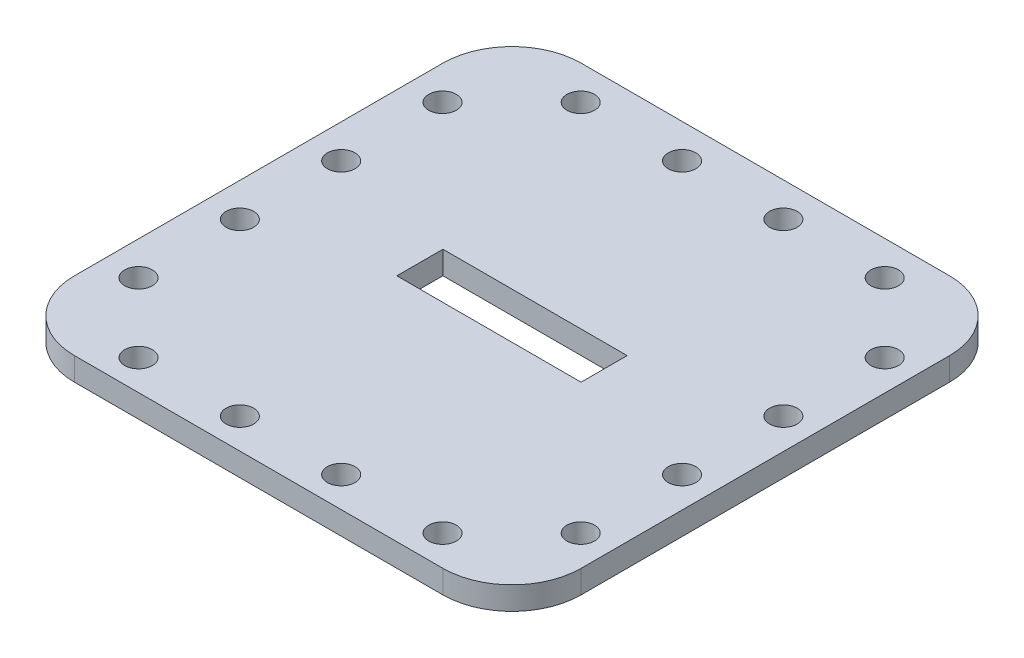
ISO-10303-21;
HEADER;
FILE_DESCRIPTION(('STEP AP214'),'2;1');
FILE_NAME('part.step','',(''),(''),'','','');
FILE_SCHEMA(('AUTOMOTIVE_DESIGN { 1 0 10303 214 1 1 1 1 }'));
ENDSEC;
DATA;
#1=APPLICATION_CONTEXT('core data for automotive mechanical design processes');
#2=APPLICATION_PROTOCOL_DEFINITION('international standard','automotive_design',2000,#1);
#3=PRODUCT_CONTEXT('',#1,'mechanical');
#4=PRODUCT('Part','Part','',(#3));
#5=PRODUCT_RELATED_PRODUCT_CATEGORY('part','',(#4));
#6=PRODUCT_DEFINITION_FORMATION('','',#4);
#7=PRODUCT_DEFINITION_CONTEXT('part definition',#1,'design');
#8=PRODUCT_DEFINITION('design','',#6,#7);
#9=PRODUCT_DEFINITION_SHAPE('','',#8);
#10=(LENGTH_UNIT() NAMED_UNIT(*) SI_UNIT(.MILLI.,.METRE.));
#11=(NAMED_UNIT(*) PLANE_ANGLE_UNIT() SI_UNIT($,.RADIAN.));
#12=(NAMED_UNIT(*) SI_UNIT($,.STERADIAN.) SOLID_ANGLE_UNIT());
#13=UNCERTAINTY_MEASURE_WITH_UNIT(LENGTH_MEASURE(1.E-05),#10,'distance_accuracy_value','');
#14=(GEOMETRIC_REPRESENTATION_CONTEXT(3) GLOBAL_UNCERTAINTY_ASSIGNED_CONTEXT((#13)) GLOBAL_UNIT_ASSIGNED_CONTEXT((#10,
#11,#12)) REPRESENTATION_CONTEXT('',''));
#15=CARTESIAN_POINT('',(0.,0.,0.));
#16=DIRECTION('',(0.,0.,1.));
#17=DIRECTION('',(1.,0.,0.));
#18=AXIS2_PLACEMENT_3D('',#15,#16,#17);
#19=CARTESIAN_POINT('',(40.,5.,55.));
#20=DIRECTION('',(0.,1.,0.));
#21=DIRECTION('',(0.,0.,1.));
#22=AXIS2_PLACEMENT_3D('',#19,#20,#21);
#23=PLANE('',#22);
#24=DIRECTION('',(0.,0.,-1.));
#25=VECTOR('',#24,1.);
#26=CARTESIAN_POINT('',(20.,5.,5.));
#27=LINE('',#26,#25);
#28=CARTESIAN_POINT('',(20.,5.,5.));
#29=VERTEX_POINT('',#28);
#30=CARTESIAN_POINT('',(20.,5.,-5.));
#31=VERTEX_POINT('',#30);
#32=EDGE_CURVE('E59',#29,#31,#27,.T.);
#33=ORIENTED_EDGE('',*,*,#32,.F.);
#34=DIRECTION('',(1.,0.,0.));
#35=VECTOR('',#34,1.);
#36=CARTESIAN_POINT('',(-20.,5.,5.));
#37=LINE('',#36,#35);
#38=CARTESIAN_POINT('',(-20.,5.,5.));
#39=VERTEX_POINT('',#38);
#40=EDGE_CURVE('E151',#39,#29,#37,.T.);
#41=ORIENTED_EDGE('',*,*,#40,.F.);
#42=DIRECTION('',(0.,0.,1.));
#43=VECTOR('',#42,1.);
#44=CARTESIAN_POINT('',(-20.,5.,5.));
#45=LINE('',#44,#43);
#46=CARTESIAN_POINT('',(-20.,5.,-5.));
#47=VERTEX_POINT('',#46);
#48=EDGE_CURVE('E135',#47,#39,#45,.T.);
#49=ORIENTED_EDGE('',*,*,#48,.F.);
#50=DIRECTION('',(-1.,0.,0.));
#51=VECTOR('',#50,1.);
#52=CARTESIAN_POINT('',(-20.,5.,-5.));
#53=LINE('',#52,#51);
#54=EDGE_CURVE('E144',#31,#47,#53,.T.);
#55=ORIENTED_EDGE('',*,*,#54,.F.);
#56=EDGE_LOOP('',(#33,#41,#49,#55));
#57=FACE_BOUND('',#56,.T.);
#58=CARTESIAN_POINT('',(48.3346963055934,5.,-10.5816296180082));
#59=DIRECTION('',(0.,-1.,0.));
#60=DIRECTION('',(0.,0.,-1.));
#61=AXIS2_PLACEMENT_3D('',#58,#59,#60);
#62=CIRCLE('',#61,3.00000000000002);
#63=CARTESIAN_POINT('',(48.3346963055934,5.,-13.5816296180082));
#64=VERTEX_POINT('',#63);
#65=EDGE_CURVE('E170',#64,#64,#62,.T.);
#66=ORIENTED_EDGE('',*,*,#65,.T.);
#67=EDGE_LOOP('',(#66));
#68=FACE_BOUND('',#67,.T.);
#69=CARTESIAN_POINT('',(-32.6653036944065,5.,-47.5816296180083));
#70=DIRECTION('',(0.,-1.,0.));
#71=DIRECTION('',(0.,0.,-1.));
#72=AXIS2_PLACEMENT_3D('',#69,#70,#71);
#73=CIRCLE('',#72,3.00000000000001);
#74=CARTESIAN_POINT('',(-32.6653036944065,5.,-50.5816296180083));
#75=VERTEX_POINT('',#74);
#76=EDGE_CURVE('E175',#75,#75,#73,.T.);
#77=ORIENTED_EDGE('',*,*,#76,.T.);
#78=EDGE_LOOP('',(#77));
#79=FACE_BOUND('',#78,.T.);
#80=CARTESIAN_POINT('',(-47.6653036944066,5.,-32.5816296180082));
#81=DIRECTION('',(0.,-1.,0.));
#82=DIRECTION('',(0.,0.,-1.));
#83=AXIS2_PLACEMENT_3D('',#80,#81,#82);
#84=CIRCLE('',#83,3.);
#85=CARTESIAN_POINT('',(-47.6653036944066,5.,-35.5816296180082));
#86=VERTEX_POINT('',#85);
#87=EDGE_CURVE('E184',#86,#86,#84,.T.);
#88=ORIENTED_EDGE('',*,*,#87,.T.);
#89=EDGE_LOOP('',(#88));
#90=FACE_BOUND('',#89,.T.);
#91=CARTESIAN_POINT('',(-47.6653036944066,5.,-10.5816296180082));
#92=DIRECTION('',(0.,-1.,0.));
#93=DIRECTION('',(0.,0.,-1.));
#94=AXIS2_PLACEMENT_3D('',#91,#92,#93);
#95=CIRCLE('',#94,3.00000000000003);
#96=CARTESIAN_POINT('',(-47.6653036944066,5.,-13.5816296180083));
#97=VERTEX_POINT('',#96);
#98=EDGE_CURVE('E189',#97,#97,#95,.T.);
#99=ORIENTED_EDGE('',*,*,#98,.T.);
#100=EDGE_LOOP('',(#99));
#101=FACE_BOUND('',#100,.T.);
#102=CARTESIAN_POINT('',(-47.6653036944066,5.,11.4183703819918));
#103=DIRECTION('',(0.,-1.,0.));
#104=DIRECTION('',(0.,0.,-1.));
#105=AXIS2_PLACEMENT_3D('',#102,#103,#104);
#106=CIRCLE('',#105,2.99999999999997);
#107=CARTESIAN_POINT('',(-47.6653036944066,5.,8.4183703819918));
#108=VERTEX_POINT('',#107);
#109=EDGE_CURVE('E197',#108,#108,#106,.T.);
#110=ORIENTED_EDGE('',*,*,#109,.T.);
#111=EDGE_LOOP('',(#110));
#112=FACE_BOUND('',#111,.T.);
#113=CARTESIAN_POINT('',(-10.6653036944066,5.,48.4183703819918));
#114=DIRECTION('',(0.,-1.,0.));
#115=DIRECTION('',(0.,0.,-1.));
#116=AXIS2_PLACEMENT_3D('',#113,#114,#115);
#117=CIRCLE('',#116,3.00000000000002);
#118=CARTESIAN_POINT('',(-10.6653036944066,5.,45.4183703819917));
#119=VERTEX_POINT('',#118);
#120=EDGE_CURVE('E201',#119,#119,#117,.T.);
#121=ORIENTED_EDGE('',*,*,#120,.T.);
#122=EDGE_LOOP('',(#121));
#123=FACE_BOUND('',#122,.T.);
#124=CARTESIAN_POINT('',(11.3346963055934,5.,48.4183703819918));
#125=DIRECTION('',(0.,-1.,0.));
#126=DIRECTION('',(0.,0.,-1.));
#127=AXIS2_PLACEMENT_3D('',#124,#125,#126);
#128=CIRCLE('',#127,2.99999999999997);
#129=CARTESIAN_POINT('',(11.3346963055934,5.,45.4183703819918));
#130=VERTEX_POINT('',#129);
#131=EDGE_CURVE('E206',#130,#130,#128,.T.);
#132=ORIENTED_EDGE('',*,*,#131,.T.);
#133=EDGE_LOOP('',(#132));
#134=FACE_BOUND('',#133,.T.);
#135=CARTESIAN_POINT('',(33.3346963055934,5.,48.4183703819918));
#136=DIRECTION('',(0.,-1.,0.));
#137=DIRECTION('',(0.,0.,-1.));
#138=AXIS2_PLACEMENT_3D('',#135,#136,#137);
#139=CIRCLE('',#138,3.00000000000001);
#140=CARTESIAN_POINT('',(33.3346963055934,5.,45.4183703819917));
#141=VERTEX_POINT('',#140);
#142=EDGE_CURVE('E211',#141,#141,#139,.T.);
#143=ORIENTED_EDGE('',*,*,#142,.T.);
#144=EDGE_LOOP('',(#143));
#145=FACE_BOUND('',#144,.T.);
#146=CARTESIAN_POINT('',(48.3346963055934,5.,11.4183703819918));
#147=DIRECTION('',(0.,-1.,0.));
#148=DIRECTION('',(0.,0.,-1.));
#149=AXIS2_PLACEMENT_3D('',#146,#147,#148);
#150=CIRCLE('',#149,2.99999999999997);
#151=CARTESIAN_POINT('',(48.3346963055934,5.,8.4183703819918));
#152=VERTEX_POINT('',#151);
#153=EDGE_CURVE('E219',#152,#152,#150,.T.);
#154=ORIENTED_EDGE('',*,*,#153,.T.);
#155=EDGE_LOOP('',(#154));
#156=FACE_BOUND('',#155,.T.);
#157=CARTESIAN_POINT('',(48.3346963055935,5.,-32.5816296180082));
#158=DIRECTION('',(0.,-1.,0.));
#159=DIRECTION('',(0.,0.,-1.));
#160=AXIS2_PLACEMENT_3D('',#157,#158,#159);
#161=CIRCLE('',#160,3.00000000000001);
#162=CARTESIAN_POINT('',(48.3346963055935,5.,-35.5816296180082));
#163=VERTEX_POINT('',#162);
#164=EDGE_CURVE('E223',#163,#163,#161,.T.);
#165=ORIENTED_EDGE('',*,*,#164,.T.);
#166=EDGE_LOOP('',(#165));
#167=FACE_BOUND('',#166,.T.);
#168=CARTESIAN_POINT('',(33.3346963055935,5.,-47.5816296180082));
#169=DIRECTION('',(0.,-1.,0.));
#170=DIRECTION('',(0.,0.,-1.));
#171=AXIS2_PLACEMENT_3D('',#168,#169,#170);
#172=CIRCLE('',#171,2.99999999999997);
#173=CARTESIAN_POINT('',(33.3346963055935,5.,-50.5816296180082));
#174=VERTEX_POINT('',#173);
#175=EDGE_CURVE('E228',#174,#174,#172,.T.);
#176=ORIENTED_EDGE('',*,*,#175,.T.);
#177=EDGE_LOOP('',(#176));
#178=FACE_BOUND('',#177,.T.);
#179=CARTESIAN_POINT('',(11.3346963055935,5.,-47.5816296180082));
#180=DIRECTION('',(0.,-1.,0.));
#181=DIRECTION('',(0.,0.,-1.));
#182=AXIS2_PLACEMENT_3D('',#179,#180,#181);
#183=CIRCLE('',#182,2.99999999999997);
#184=CARTESIAN_POINT('',(11.3346963055935,5.,-50.5816296180082));
#185=VERTEX_POINT('',#184);
#186=EDGE_CURVE('E233',#185,#185,#183,.T.);
#187=ORIENTED_EDGE('',*,*,#186,.T.);
#188=EDGE_LOOP('',(#187));
#189=FACE_BOUND('',#188,.T.);
#190=CARTESIAN_POINT('',(-10.6653036944065,5.,-47.5816296180082));
#191=DIRECTION('',(0.,-1.,0.));
#192=DIRECTION('',(0.,0.,-1.));
#193=AXIS2_PLACEMENT_3D('',#190,#191,#192);
#194=CIRCLE('',#193,3.00000000000002);
#195=CARTESIAN_POINT('',(-10.6653036944065,5.,-50.5816296180083));
#196=VERTEX_POINT('',#195);
#197=EDGE_CURVE('E241',#196,#196,#194,.T.);
#198=ORIENTED_EDGE('',*,*,#197,.T.);
#199=EDGE_LOOP('',(#198));
#200=FACE_BOUND('',#199,.T.);
#201=CARTESIAN_POINT('',(-47.6653036944065,5.,33.4183703819918));
#202=DIRECTION('',(0.,-1.,0.));
#203=DIRECTION('',(0.,0.,-1.));
#204=AXIS2_PLACEMENT_3D('',#201,#202,#203);
#205=CIRCLE('',#204,3.);
#206=CARTESIAN_POINT('',(-47.6653036944065,5.,30.4183703819918));
#207=VERTEX_POINT('',#206);
#208=EDGE_CURVE('E245',#207,#207,#205,.T.);
#209=ORIENTED_EDGE('',*,*,#208,.T.);
#210=EDGE_LOOP('',(#209));
#211=FACE_BOUND('',#210,.T.);
#212=CARTESIAN_POINT('',(-32.6653036944065,5.,48.4183703819918));
#213=DIRECTION('',(0.,-1.,0.));
#214=DIRECTION('',(0.,0.,-1.));
#215=AXIS2_PLACEMENT_3D('',#212,#213,#214);
#216=CIRCLE('',#215,3.00000000000001);
#217=CARTESIAN_POINT('',(-32.6653036944065,5.,45.4183703819918));
#218=VERTEX_POINT('',#217);
#219=EDGE_CURVE('E250',#218,#218,#216,.T.);
#220=ORIENTED_EDGE('',*,*,#219,.T.);
#221=EDGE_LOOP('',(#220));
#222=FACE_BOUND('',#221,.T.);
#223=CARTESIAN_POINT('',(48.3346963055934,5.,33.4183703819918));
#224=DIRECTION('',(0.,-1.,0.));
#225=DIRECTION('',(0.,0.,-1.));
#226=AXIS2_PLACEMENT_3D('',#223,#224,#225);
#227=CIRCLE('',#226,3.00000000000001);
#228=CARTESIAN_POINT('',(48.3346963055934,5.,30.4183703819918));
#229=VERTEX_POINT('',#228);
#230=EDGE_CURVE('E255',#229,#229,#227,.T.);
#231=ORIENTED_EDGE('',*,*,#230,.T.);
#232=EDGE_LOOP('',(#231));
#233=FACE_BOUND('',#232,.T.);
#234=DIRECTION('',(1.,0.,0.));
#235=VECTOR('',#234,1.);
#236=CARTESIAN_POINT('',(-55.,5.,55.));
#237=LINE('',#236,#235);
#238=CARTESIAN_POINT('',(-40.,5.,55.));
#239=VERTEX_POINT('',#238);
#240=CARTESIAN_POINT('',(40.,5.,55.));
#241=VERTEX_POINT('',#240);
#242=EDGE_CURVE('E262',#239,#241,#237,.T.);
#243=ORIENTED_EDGE('',*,*,#242,.T.);
#244=CARTESIAN_POINT('',(40.,5.,40.));
#245=DIRECTION('',(0.,-1.,0.));
#246=DIRECTION('',(0.,0.,-1.));
#247=AXIS2_PLACEMENT_3D('',#244,#245,#246);
#248=CIRCLE('',#247,15.);
#249=CARTESIAN_POINT('',(55.,5.,40.));
#250=VERTEX_POINT('',#249);
#251=EDGE_CURVE('E347',#241,#250,#248,.F.);
#252=ORIENTED_EDGE('',*,*,#251,.T.);
#253=DIRECTION('',(0.,0.,-1.));
#254=VECTOR('',#253,1.);
#255=CARTESIAN_POINT('',(55.,5.,55.));
#256=LINE('',#255,#254);
#257=CARTESIAN_POINT('',(55.,5.,-40.));
#258=VERTEX_POINT('',#257);
#259=EDGE_CURVE('E177',#250,#258,#256,.T.);
#260=ORIENTED_EDGE('',*,*,#259,.T.);
#261=CARTESIAN_POINT('',(40.,5.,-40.));
#262=DIRECTION('',(0.,-1.,0.));
#263=DIRECTION('',(0.,0.,-1.));
#264=AXIS2_PLACEMENT_3D('',#261,#262,#263);
#265=CIRCLE('',#264,15.);
#266=CARTESIAN_POINT('',(40.,5.,-55.));
#267=VERTEX_POINT('',#266);
#268=EDGE_CURVE('E318',#258,#267,#265,.F.);
#269=ORIENTED_EDGE('',*,*,#268,.T.);
#270=DIRECTION('',(-1.,0.,0.));
#271=VECTOR('',#270,1.);
#272=CARTESIAN_POINT('',(-55.,5.,-55.));
#273=LINE('',#272,#271);
#274=CARTESIAN_POINT('',(-40.,5.,-55.));
#275=VERTEX_POINT('',#274);
#276=EDGE_CURVE('E273',#267,#275,#273,.T.);
#277=ORIENTED_EDGE('',*,*,#276,.T.);
#278=CARTESIAN_POINT('',(-40.,5.,-40.));
#279=DIRECTION('',(0.,-1.,0.));
#280=DIRECTION('',(0.,0.,-1.));
#281=AXIS2_PLACEMENT_3D('',#278,#279,#280);
#282=CIRCLE('',#281,15.);
#283=CARTESIAN_POINT('',(-55.,5.,-40.));
#284=VERTEX_POINT('',#283);
#285=EDGE_CURVE('E330',#275,#284,#282,.F.);
#286=ORIENTED_EDGE('',*,*,#285,.T.);
#287=DIRECTION('',(0.,0.,1.));
#288=VECTOR('',#287,1.);
#289=CARTESIAN_POINT('',(-55.,5.,55.));
#290=LINE('',#289,#288);
#291=CARTESIAN_POINT('',(-55.,5.,40.));
#292=VERTEX_POINT('',#291);
#293=EDGE_CURVE('E267',#284,#292,#290,.T.);
#294=ORIENTED_EDGE('',*,*,#293,.T.);
#295=CARTESIAN_POINT('',(-40.,5.,40.));
#296=DIRECTION('',(0.,-1.,0.));
#297=DIRECTION('',(0.,0.,-1.));
#298=AXIS2_PLACEMENT_3D('',#295,#296,#297);
#299=CIRCLE('',#298,15.);
#300=EDGE_CURVE('E339',#292,#239,#299,.F.);
#301=ORIENTED_EDGE('',*,*,#300,.T.);
#302=EDGE_LOOP('',(#243,#252,#260,#269,#277,#286,#294,#301));
#303=FACE_BOUND('',#302,.T.);
#304=ADVANCED_FACE('F45',(#57,#68,#79,#90,#101,#112,#123,#134,#145,#156,#167,#178,#189,#200,
#211,#222,#233,#303),#23,.T.);
#305=CARTESIAN_POINT('',(40.,5.,-40.));
#306=DIRECTION('',(0.,1.,0.));
#307=DIRECTION('',(0.,0.,1.));
#308=AXIS2_PLACEMENT_3D('',#305,#306,#307);
#309=CYLINDRICAL_SURFACE('',#308,15.);
#310=DIRECTION('',(0.,1.,0.));
#311=VECTOR('',#310,1.);
#312=CARTESIAN_POINT('',(55.,5.,-40.));
#313=LINE('',#312,#311);
#314=CARTESIAN_POINT('',(55.,0.,-40.));
#315=VERTEX_POINT('',#314);
#316=EDGE_CURVE('E268',#315,#258,#313,.T.);
#317=ORIENTED_EDGE('',*,*,#316,.F.);
#318=CARTESIAN_POINT('',(40.,0.,-40.));
#319=DIRECTION('',(0.,-1.,0.));
#320=DIRECTION('',(0.,0.,-1.));
#321=AXIS2_PLACEMENT_3D('',#318,#319,#320);
#322=CIRCLE('',#321,15.);
#323=CARTESIAN_POINT('',(40.,0.,-55.));
#324=VERTEX_POINT('',#323);
#325=EDGE_CURVE('E313',#324,#315,#322,.T.);
#326=ORIENTED_EDGE('',*,*,#325,.F.);
#327=DIRECTION('',(0.,1.,0.));
#328=VECTOR('',#327,1.);
#329=CARTESIAN_POINT('',(40.,5.,-55.));
#330=LINE('',#329,#328);
#331=EDGE_CURVE('E317',#267,#324,#330,.F.);
#332=ORIENTED_EDGE('',*,*,#331,.F.);
#333=ORIENTED_EDGE('',*,*,#268,.F.);
#334=EDGE_LOOP('',(#317,#326,#332,#333));
#335=FACE_BOUND('',#334,.T.);
#336=ADVANCED_FACE('F320',(#335),#309,.T.);
#337=CARTESIAN_POINT('',(-40.,5.,-40.));
#338=DIRECTION('',(0.,1.,0.));
#339=DIRECTION('',(0.,0.,1.));
#340=AXIS2_PLACEMENT_3D('',#337,#338,#339);
#341=CYLINDRICAL_SURFACE('',#340,15.);
#342=DIRECTION('',(0.,1.,0.));
#343=VECTOR('',#342,1.);
#344=CARTESIAN_POINT('',(-40.,5.,-55.));
#345=LINE('',#344,#343);
#346=CARTESIAN_POINT('',(-40.,0.,-55.));
#347=VERTEX_POINT('',#346);
#348=EDGE_CURVE('E323',#347,#275,#345,.T.);
#349=ORIENTED_EDGE('',*,*,#348,.F.);
#350=CARTESIAN_POINT('',(-40.,0.,-40.));
#351=DIRECTION('',(0.,-1.,0.));
#352=DIRECTION('',(0.,0.,-1.));
#353=AXIS2_PLACEMENT_3D('',#350,#351,#352);
#354=CIRCLE('',#353,15.);
#355=CARTESIAN_POINT('',(-55.,0.,-40.));
#356=VERTEX_POINT('',#355);
#357=EDGE_CURVE('E328',#356,#347,#354,.T.);
#358=ORIENTED_EDGE('',*,*,#357,.F.);
#359=DIRECTION('',(0.,1.,0.));
#360=VECTOR('',#359,1.);
#361=CARTESIAN_POINT('',(-55.,5.,-40.));
#362=LINE('',#361,#360);
#363=EDGE_CURVE('E325',#284,#356,#362,.F.);
#364=ORIENTED_EDGE('',*,*,#363,.F.);
#365=ORIENTED_EDGE('',*,*,#285,.F.);
#366=EDGE_LOOP('',(#349,#358,#364,#365));
#367=FACE_BOUND('',#366,.T.);
#368=ADVANCED_FACE('F435',(#367),#341,.T.);
#369=CARTESIAN_POINT('',(-40.,5.,40.));
#370=DIRECTION('',(0.,1.,0.));
#371=DIRECTION('',(0.,0.,1.));
#372=AXIS2_PLACEMENT_3D('',#369,#370,#371);
#373=CYLINDRICAL_SURFACE('',#372,15.);
#374=DIRECTION('',(0.,1.,0.));
#375=VECTOR('',#374,1.);
#376=CARTESIAN_POINT('',(-55.,5.,40.));
#377=LINE('',#376,#375);
#378=CARTESIAN_POINT('',(-55.,0.,40.));
#379=VERTEX_POINT('',#378);
#380=EDGE_CURVE('E332',#379,#292,#377,.T.);
#381=ORIENTED_EDGE('',*,*,#380,.F.);
#382=CARTESIAN_POINT('',(-40.,0.,40.));
#383=DIRECTION('',(0.,-1.,0.));
#384=DIRECTION('',(0.,0.,-1.));
#385=AXIS2_PLACEMENT_3D('',#382,#383,#384);
#386=CIRCLE('',#385,15.);
#387=CARTESIAN_POINT('',(-40.,0.,55.));
#388=VERTEX_POINT('',#387);
#389=EDGE_CURVE('E337',#388,#379,#386,.T.);
#390=ORIENTED_EDGE('',*,*,#389,.F.);
#391=DIRECTION('',(0.,1.,0.));
#392=VECTOR('',#391,1.);
#393=CARTESIAN_POINT('',(-40.,5.,55.));
#394=LINE('',#393,#392);
#395=EDGE_CURVE('E335',#239,#388,#394,.F.);
#396=ORIENTED_EDGE('',*,*,#395,.F.);
#397=ORIENTED_EDGE('',*,*,#300,.F.);
#398=EDGE_LOOP('',(#381,#390,#396,#397));
#399=FACE_BOUND('',#398,.T.);
#400=ADVANCED_FACE('F440',(#399),#373,.T.);
#401=CARTESIAN_POINT('',(40.,5.,40.));
#402=DIRECTION('',(0.,1.,0.));
#403=DIRECTION('',(0.,0.,1.));
#404=AXIS2_PLACEMENT_3D('',#401,#402,#403);
#405=CYLINDRICAL_SURFACE('',#404,15.);
#406=DIRECTION('',(0.,1.,0.));
#407=VECTOR('',#406,1.);
#408=CARTESIAN_POINT('',(40.,5.,55.));
#409=LINE('',#408,#407);
#410=CARTESIAN_POINT('',(40.,0.,55.));
#411=VERTEX_POINT('',#410);
#412=EDGE_CURVE('E342',#411,#241,#409,.T.);
#413=ORIENTED_EDGE('',*,*,#412,.F.);
#414=CARTESIAN_POINT('',(40.,0.,40.));
#415=DIRECTION('',(0.,-1.,0.));
#416=DIRECTION('',(0.,0.,-1.));
#417=AXIS2_PLACEMENT_3D('',#414,#415,#416);
#418=CIRCLE('',#417,15.);
#419=CARTESIAN_POINT('',(55.,0.,40.));
#420=VERTEX_POINT('',#419);
#421=EDGE_CURVE('E345',#420,#411,#418,.T.);
#422=ORIENTED_EDGE('',*,*,#421,.F.);
#423=DIRECTION('',(0.,1.,0.));
#424=VECTOR('',#423,1.);
#425=CARTESIAN_POINT('',(55.,5.,40.));
#426=LINE('',#425,#424);
#427=EDGE_CURVE('E311',#250,#420,#426,.F.);
#428=ORIENTED_EDGE('',*,*,#427,.F.);
#429=ORIENTED_EDGE('',*,*,#251,.F.);
#430=EDGE_LOOP('',(#413,#422,#428,#429));
#431=FACE_BOUND('',#430,.T.);
#432=ADVANCED_FACE('F455',(#431),#405,.T.);
#433=CARTESIAN_POINT('',(0.,0.,0.));
#434=DIRECTION('',(0.,-1.,0.));
#435=DIRECTION('',(0.,0.,-1.));
#436=AXIS2_PLACEMENT_3D('',#433,#434,#435);
#437=PLANE('',#436);
#438=DIRECTION('',(0.,0.,1.));
#439=VECTOR('',#438,1.);
#440=CARTESIAN_POINT('',(20.,0.,0.));
#441=LINE('',#440,#439);
#442=CARTESIAN_POINT('',(20.,0.,-5.));
#443=VERTEX_POINT('',#442);
#444=CARTESIAN_POINT('',(20.,0.,5.));
#445=VERTEX_POINT('',#444);
#446=EDGE_CURVE('E12',#443,#445,#441,.T.);
#447=ORIENTED_EDGE('',*,*,#446,.F.);
#448=DIRECTION('',(1.,0.,0.));
#449=VECTOR('',#448,1.);
#450=CARTESIAN_POINT('',(0.,0.,-5.));
#451=LINE('',#450,#449);
#452=CARTESIAN_POINT('',(-20.,0.,-5.));
#453=VERTEX_POINT('',#452);
#454=EDGE_CURVE('E361',#453,#443,#451,.T.);
#455=ORIENTED_EDGE('',*,*,#454,.F.);
#456=DIRECTION('',(0.,0.,-1.));
#457=VECTOR('',#456,1.);
#458=CARTESIAN_POINT('',(-20.,0.,0.));
#459=LINE('',#458,#457);
#460=CARTESIAN_POINT('',(-20.,0.,5.));
#461=VERTEX_POINT('',#460);
#462=EDGE_CURVE('E138',#461,#453,#459,.T.);
#463=ORIENTED_EDGE('',*,*,#462,.F.);
#464=DIRECTION('',(-1.,0.,0.));
#465=VECTOR('',#464,1.);
#466=CARTESIAN_POINT('',(0.,0.,5.));
#467=LINE('',#466,#465);
#468=EDGE_CURVE('E52',#445,#461,#467,.T.);
#469=ORIENTED_EDGE('',*,*,#468,.F.);
#470=EDGE_LOOP('',(#447,#455,#463,#469));
#471=FACE_BOUND('',#470,.T.);
#472=CARTESIAN_POINT('',(48.3346963055934,0.,-10.5816296180082));
#473=DIRECTION('',(0.,-1.,0.));
#474=DIRECTION('',(0.,0.,-1.));
#475=AXIS2_PLACEMENT_3D('',#472,#473,#474);
#476=CIRCLE('',#475,3.00000000000002);
#477=CARTESIAN_POINT('',(48.3346963055934,0.,-13.5816296180082));
#478=VERTEX_POINT('',#477);
#479=EDGE_CURVE('E387',#478,#478,#476,.T.);
#480=ORIENTED_EDGE('',*,*,#479,.F.);
#481=EDGE_LOOP('',(#480));
#482=FACE_BOUND('',#481,.T.);
#483=CARTESIAN_POINT('',(-32.6653036944065,0.,-47.5816296180083));
#484=DIRECTION('',(0.,-1.,0.));
#485=DIRECTION('',(0.,0.,-1.));
#486=AXIS2_PLACEMENT_3D('',#483,#484,#485);
#487=CIRCLE('',#486,3.00000000000001);
#488=CARTESIAN_POINT('',(-32.6653036944065,0.,-50.5816296180083));
#489=VERTEX_POINT('',#488);
#490=EDGE_CURVE('E390',#489,#489,#487,.T.);
#491=ORIENTED_EDGE('',*,*,#490,.F.);
#492=EDGE_LOOP('',(#491));
#493=FACE_BOUND('',#492,.T.);
#494=CARTESIAN_POINT('',(-47.6653036944066,0.,-32.5816296180082));
#495=DIRECTION('',(0.,-1.,0.));
#496=DIRECTION('',(0.,0.,-1.));
#497=AXIS2_PLACEMENT_3D('',#494,#495,#496);
#498=CIRCLE('',#497,3.);
#499=CARTESIAN_POINT('',(-47.6653036944066,0.,-35.5816296180082));
#500=VERTEX_POINT('',#499);
#501=EDGE_CURVE('E394',#500,#500,#498,.T.);
#502=ORIENTED_EDGE('',*,*,#501,.F.);
#503=EDGE_LOOP('',(#502));
#504=FACE_BOUND('',#503,.T.);
#505=CARTESIAN_POINT('',(-47.6653036944066,0.,-10.5816296180082));
#506=DIRECTION('',(0.,-1.,0.));
#507=DIRECTION('',(0.,0.,-1.));
#508=AXIS2_PLACEMENT_3D('',#505,#506,#507);
#509=CIRCLE('',#508,3.00000000000003);
#510=CARTESIAN_POINT('',(-47.6653036944066,0.,-13.5816296180083));
#511=VERTEX_POINT('',#510);
#512=EDGE_CURVE('E397',#511,#511,#509,.T.);
#513=ORIENTED_EDGE('',*,*,#512,.F.);
#514=EDGE_LOOP('',(#513));
#515=FACE_BOUND('',#514,.T.);
#516=CARTESIAN_POINT('',(-47.6653036944066,0.,11.4183703819918));
#517=DIRECTION('',(0.,-1.,0.));
#518=DIRECTION('',(0.,0.,-1.));
#519=AXIS2_PLACEMENT_3D('',#516,#517,#518);
#520=CIRCLE('',#519,2.99999999999997);
#521=CARTESIAN_POINT('',(-47.6653036944066,0.,8.4183703819918));
#522=VERTEX_POINT('',#521);
#523=EDGE_CURVE('E400',#522,#522,#520,.T.);
#524=ORIENTED_EDGE('',*,*,#523,.F.);
#525=EDGE_LOOP('',(#524));
#526=FACE_BOUND('',#525,.T.);
#527=CARTESIAN_POINT('',(-10.6653036944066,0.,48.4183703819918));
#528=DIRECTION('',(0.,-1.,0.));
#529=DIRECTION('',(0.,0.,-1.));
#530=AXIS2_PLACEMENT_3D('',#527,#528,#529);
#531=CIRCLE('',#530,3.00000000000002);
#532=CARTESIAN_POINT('',(-10.6653036944066,0.,45.4183703819917));
#533=VERTEX_POINT('',#532);
#534=EDGE_CURVE('E403',#533,#533,#531,.T.);
#535=ORIENTED_EDGE('',*,*,#534,.F.);
#536=EDGE_LOOP('',(#535));
#537=FACE_BOUND('',#536,.T.);
#538=CARTESIAN_POINT('',(11.3346963055934,0.,48.4183703819918));
#539=DIRECTION('',(0.,-1.,0.));
#540=DIRECTION('',(0.,0.,-1.));
#541=AXIS2_PLACEMENT_3D('',#538,#539,#540);
#542=CIRCLE('',#541,2.99999999999997);
#543=CARTESIAN_POINT('',(11.3346963055934,0.,45.4183703819918));
#544=VERTEX_POINT('',#543);
#545=EDGE_CURVE('E406',#544,#544,#542,.T.);
#546=ORIENTED_EDGE('',*,*,#545,.F.);
#547=EDGE_LOOP('',(#546));
#548=FACE_BOUND('',#547,.T.);
#549=CARTESIAN_POINT('',(33.3346963055934,0.,48.4183703819918));
#550=DIRECTION('',(0.,-1.,0.));
#551=DIRECTION('',(0.,0.,-1.));
#552=AXIS2_PLACEMENT_3D('',#549,#550,#551);
#553=CIRCLE('',#552,3.00000000000001);
#554=CARTESIAN_POINT('',(33.3346963055934,0.,45.4183703819917));
#555=VERTEX_POINT('',#554);
#556=EDGE_CURVE('E370',#555,#555,#553,.T.);
#557=ORIENTED_EDGE('',*,*,#556,.F.);
#558=EDGE_LOOP('',(#557));
#559=FACE_BOUND('',#558,.T.);
#560=CARTESIAN_POINT('',(48.3346963055934,0.,11.4183703819918));
#561=DIRECTION('',(0.,-1.,0.));
#562=DIRECTION('',(0.,0.,-1.));
#563=AXIS2_PLACEMENT_3D('',#560,#561,#562);
#564=CIRCLE('',#563,2.99999999999997);
#565=CARTESIAN_POINT('',(48.3346963055934,0.,8.4183703819918));
#566=VERTEX_POINT('',#565);
#567=EDGE_CURVE('E366',#566,#566,#564,.T.);
#568=ORIENTED_EDGE('',*,*,#567,.F.);
#569=EDGE_LOOP('',(#568));
#570=FACE_BOUND('',#569,.T.);
#571=CARTESIAN_POINT('',(48.3346963055935,0.,-32.5816296180082));
#572=DIRECTION('',(0.,-1.,0.));
#573=DIRECTION('',(0.,0.,-1.));
#574=AXIS2_PLACEMENT_3D('',#571,#572,#573);
#575=CIRCLE('',#574,3.00000000000001);
#576=CARTESIAN_POINT('',(48.3346963055935,0.,-35.5816296180082));
#577=VERTEX_POINT('',#576);
#578=EDGE_CURVE('E369',#577,#577,#575,.T.);
#579=ORIENTED_EDGE('',*,*,#578,.F.);
#580=EDGE_LOOP('',(#579));
#581=FACE_BOUND('',#580,.T.);
#582=CARTESIAN_POINT('',(33.3346963055935,0.,-47.5816296180082));
#583=DIRECTION('',(0.,-1.,0.));
#584=DIRECTION('',(0.,0.,-1.));
#585=AXIS2_PLACEMENT_3D('',#582,#583,#584);
#586=CIRCLE('',#585,2.99999999999997);
#587=CARTESIAN_POINT('',(33.3346963055935,0.,-50.5816296180082));
#588=VERTEX_POINT('',#587);
#589=EDGE_CURVE('E373',#588,#588,#586,.T.);
#590=ORIENTED_EDGE('',*,*,#589,.F.);
#591=EDGE_LOOP('',(#590));
#592=FACE_BOUND('',#591,.T.);
#593=CARTESIAN_POINT('',(11.3346963055935,0.,-47.5816296180082));
#594=DIRECTION('',(0.,-1.,0.));
#595=DIRECTION('',(0.,0.,-1.));
#596=AXIS2_PLACEMENT_3D('',#593,#594,#595);
#597=CIRCLE('',#596,2.99999999999997);
#598=CARTESIAN_POINT('',(11.3346963055935,0.,-50.5816296180082));
#599=VERTEX_POINT('',#598);
#600=EDGE_CURVE('E376',#599,#599,#597,.T.);
#601=ORIENTED_EDGE('',*,*,#600,.F.);
#602=EDGE_LOOP('',(#601));
#603=FACE_BOUND('',#602,.T.);
#604=CARTESIAN_POINT('',(-10.6653036944065,0.,-47.5816296180082));
#605=DIRECTION('',(0.,-1.,0.));
#606=DIRECTION('',(0.,0.,-1.));
#607=AXIS2_PLACEMENT_3D('',#604,#605,#606);
#608=CIRCLE('',#607,3.00000000000002);
#609=CARTESIAN_POINT('',(-10.6653036944065,0.,-50.5816296180083));
#610=VERTEX_POINT('',#609);
#611=EDGE_CURVE('E379',#610,#610,#608,.T.);
#612=ORIENTED_EDGE('',*,*,#611,.F.);
#613=EDGE_LOOP('',(#612));
#614=FACE_BOUND('',#613,.T.);
#615=CARTESIAN_POINT('',(-47.6653036944065,0.,33.4183703819918));
#616=DIRECTION('',(0.,-1.,0.));
#617=DIRECTION('',(0.,0.,-1.));
#618=AXIS2_PLACEMENT_3D('',#615,#616,#617);
#619=CIRCLE('',#618,3.);
#620=CARTESIAN_POINT('',(-47.6653036944065,0.,30.4183703819918));
#621=VERTEX_POINT('',#620);
#622=EDGE_CURVE('E382',#621,#621,#619,.T.);
#623=ORIENTED_EDGE('',*,*,#622,.F.);
#624=EDGE_LOOP('',(#623));
#625=FACE_BOUND('',#624,.T.);
#626=CARTESIAN_POINT('',(-32.6653036944065,0.,48.4183703819918));
#627=DIRECTION('',(0.,-1.,0.));
#628=DIRECTION('',(0.,0.,-1.));
#629=AXIS2_PLACEMENT_3D('',#626,#627,#628);
#630=CIRCLE('',#629,3.00000000000001);
#631=CARTESIAN_POINT('',(-32.6653036944065,0.,45.4183703819918));
#632=VERTEX_POINT('',#631);
#633=EDGE_CURVE('E363',#632,#632,#630,.T.);
#634=ORIENTED_EDGE('',*,*,#633,.F.);
#635=EDGE_LOOP('',(#634));
#636=FACE_BOUND('',#635,.T.);
#637=CARTESIAN_POINT('',(48.3346963055934,0.,33.4183703819918));
#638=DIRECTION('',(0.,-1.,0.));
#639=DIRECTION('',(0.,0.,-1.));
#640=AXIS2_PLACEMENT_3D('',#637,#638,#639);
#641=CIRCLE('',#640,3.00000000000001);
#642=CARTESIAN_POINT('',(48.3346963055934,0.,30.4183703819918));
#643=VERTEX_POINT('',#642);
#644=EDGE_CURVE('E391',#643,#643,#641,.T.);
#645=ORIENTED_EDGE('',*,*,#644,.F.);
#646=EDGE_LOOP('',(#645));
#647=FACE_BOUND('',#646,.T.);
#648=DIRECTION('',(0.,0.,-1.));
#649=VECTOR('',#648,1.);
#650=CARTESIAN_POINT('',(55.,0.,55.));
#651=LINE('',#650,#649);
#652=EDGE_CURVE('E176',#420,#315,#651,.T.);
#653=ORIENTED_EDGE('',*,*,#652,.F.);
#654=ORIENTED_EDGE('',*,*,#421,.T.);
#655=DIRECTION('',(1.,0.,0.));
#656=VECTOR('',#655,1.);
#657=CARTESIAN_POINT('',(-55.,0.,55.));
#658=LINE('',#657,#656);
#659=EDGE_CURVE('E282',#388,#411,#658,.T.);
#660=ORIENTED_EDGE('',*,*,#659,.F.);
#661=ORIENTED_EDGE('',*,*,#389,.T.);
#662=DIRECTION('',(0.,0.,1.));
#663=VECTOR('',#662,1.);
#664=CARTESIAN_POINT('',(-55.,0.,55.));
#665=LINE('',#664,#663);
#666=EDGE_CURVE('E287',#356,#379,#665,.T.);
#667=ORIENTED_EDGE('',*,*,#666,.F.);
#668=ORIENTED_EDGE('',*,*,#357,.T.);
#669=DIRECTION('',(-1.,0.,0.));
#670=VECTOR('',#669,1.);
#671=CARTESIAN_POINT('',(-55.,0.,-55.));
#672=LINE('',#671,#670);
#673=EDGE_CURVE('E294',#324,#347,#672,.T.);
#674=ORIENTED_EDGE('',*,*,#673,.F.);
#675=ORIENTED_EDGE('',*,*,#325,.T.);
#676=EDGE_LOOP('',(#653,#654,#660,#661,#667,#668,#674,#675));
#677=FACE_BOUND('',#676,.T.);
#678=ADVANCED_FACE('F314',(#471,#482,#493,#504,#515,#526,#537,#548,#559,#570,#581,#592,#603,
#614,#625,#636,#647,#677),#437,.T.);
#679=CARTESIAN_POINT('',(48.3346963055934,10.,-10.5816296180082));
#680=DIRECTION('',(0.,-1.,0.));
#681=DIRECTION('',(0.,0.,-1.));
#682=AXIS2_PLACEMENT_3D('',#679,#680,#681);
#683=CYLINDRICAL_SURFACE('',#682,3.00000000000002);
#684=ORIENTED_EDGE('',*,*,#479,.T.);
#685=EDGE_LOOP('',(#684));
#686=FACE_BOUND('',#685,.T.);
#687=ORIENTED_EDGE('',*,*,#65,.F.);
#688=EDGE_LOOP('',(#687));
#689=FACE_BOUND('',#688,.T.);
#690=ADVANCED_FACE('F454',(#686,#689),#683,.F.);
#691=CARTESIAN_POINT('',(-32.6653036944065,10.,-47.5816296180083));
#692=DIRECTION('',(0.,-1.,0.));
#693=DIRECTION('',(0.,0.,-1.));
#694=AXIS2_PLACEMENT_3D('',#691,#692,#693);
#695=CYLINDRICAL_SURFACE('',#694,3.00000000000001);
#696=ORIENTED_EDGE('',*,*,#490,.T.);
#697=EDGE_LOOP('',(#696));
#698=FACE_BOUND('',#697,.T.);
#699=ORIENTED_EDGE('',*,*,#76,.F.);
#700=EDGE_LOOP('',(#699));
#701=FACE_BOUND('',#700,.T.);
#702=ADVANCED_FACE('F461',(#698,#701),#695,.F.);
#703=CARTESIAN_POINT('',(-47.6653036944066,10.,-32.5816296180082));
#704=DIRECTION('',(0.,-1.,0.));
#705=DIRECTION('',(0.,0.,-1.));
#706=AXIS2_PLACEMENT_3D('',#703,#704,#705);
#707=CYLINDRICAL_SURFACE('',#706,3.);
#708=ORIENTED_EDGE('',*,*,#501,.T.);
#709=EDGE_LOOP('',(#708));
#710=FACE_BOUND('',#709,.T.);
#711=ORIENTED_EDGE('',*,*,#87,.F.);
#712=EDGE_LOOP('',(#711));
#713=FACE_BOUND('',#712,.T.);
#714=ADVANCED_FACE('F669',(#710,#713),#707,.F.);
#715=CARTESIAN_POINT('',(-47.6653036944066,10.,-10.5816296180082));
#716=DIRECTION('',(0.,-1.,0.));
#717=DIRECTION('',(0.,0.,-1.));
#718=AXIS2_PLACEMENT_3D('',#715,#716,#717);
#719=CYLINDRICAL_SURFACE('',#718,3.00000000000003);
#720=ORIENTED_EDGE('',*,*,#512,.T.);
#721=EDGE_LOOP('',(#720));
#722=FACE_BOUND('',#721,.T.);
#723=ORIENTED_EDGE('',*,*,#98,.F.);
#724=EDGE_LOOP('',(#723));
#725=FACE_BOUND('',#724,.T.);
#726=ADVANCED_FACE('F658',(#722,#725),#719,.F.);
#727=CARTESIAN_POINT('',(-47.6653036944066,10.,11.4183703819918));
#728=DIRECTION('',(0.,-1.,0.));
#729=DIRECTION('',(0.,0.,-1.));
#730=AXIS2_PLACEMENT_3D('',#727,#728,#729);
#731=CYLINDRICAL_SURFACE('',#730,2.99999999999997);
#732=ORIENTED_EDGE('',*,*,#523,.T.);
#733=EDGE_LOOP('',(#732));
#734=FACE_BOUND('',#733,.T.);
#735=ORIENTED_EDGE('',*,*,#109,.F.);
#736=EDGE_LOOP('',(#735));
#737=FACE_BOUND('',#736,.T.);
#738=ADVANCED_FACE('F647',(#734,#737),#731,.F.);
#739=CARTESIAN_POINT('',(-10.6653036944066,10.,48.4183703819918));
#740=DIRECTION('',(0.,-1.,0.));
#741=DIRECTION('',(0.,0.,-1.));
#742=AXIS2_PLACEMENT_3D('',#739,#740,#741);
#743=CYLINDRICAL_SURFACE('',#742,3.00000000000002);
#744=ORIENTED_EDGE('',*,*,#534,.T.);
#745=EDGE_LOOP('',(#744));
#746=FACE_BOUND('',#745,.T.);
#747=ORIENTED_EDGE('',*,*,#120,.F.);
#748=EDGE_LOOP('',(#747));
#749=FACE_BOUND('',#748,.T.);
#750=ADVANCED_FACE('F636',(#746,#749),#743,.F.);
#751=CARTESIAN_POINT('',(11.3346963055934,10.,48.4183703819918));
#752=DIRECTION('',(0.,-1.,0.));
#753=DIRECTION('',(0.,0.,-1.));
#754=AXIS2_PLACEMENT_3D('',#751,#752,#753);
#755=CYLINDRICAL_SURFACE('',#754,2.99999999999997);
#756=ORIENTED_EDGE('',*,*,#545,.T.);
#757=EDGE_LOOP('',(#756));
#758=FACE_BOUND('',#757,.T.);
#759=ORIENTED_EDGE('',*,*,#131,.F.);
#760=EDGE_LOOP('',(#759));
#761=FACE_BOUND('',#760,.T.);
#762=ADVANCED_FACE('F626',(#758,#761),#755,.F.);
#763=CARTESIAN_POINT('',(33.3346963055934,10.,48.4183703819918));
#764=DIRECTION('',(0.,-1.,0.));
#765=DIRECTION('',(0.,0.,-1.));
#766=AXIS2_PLACEMENT_3D('',#763,#764,#765);
#767=CYLINDRICAL_SURFACE('',#766,3.00000000000001);
#768=ORIENTED_EDGE('',*,*,#556,.T.);
#769=EDGE_LOOP('',(#768));
#770=FACE_BOUND('',#769,.T.);
#771=ORIENTED_EDGE('',*,*,#142,.F.);
#772=EDGE_LOOP('',(#771));
#773=FACE_BOUND('',#772,.T.);
#774=ADVANCED_FACE('F616',(#770,#773),#767,.F.);
#775=CARTESIAN_POINT('',(48.3346963055934,10.,11.4183703819918));
#776=DIRECTION('',(0.,-1.,0.));
#777=DIRECTION('',(0.,0.,-1.));
#778=AXIS2_PLACEMENT_3D('',#775,#776,#777);
#779=CYLINDRICAL_SURFACE('',#778,2.99999999999997);
#780=ORIENTED_EDGE('',*,*,#567,.T.);
#781=EDGE_LOOP('',(#780));
#782=FACE_BOUND('',#781,.T.);
#783=ORIENTED_EDGE('',*,*,#153,.F.);
#784=EDGE_LOOP('',(#783));
#785=FACE_BOUND('',#784,.T.);
#786=ADVANCED_FACE('F605',(#782,#785),#779,.F.);
#787=CARTESIAN_POINT('',(48.3346963055935,10.,-32.5816296180082));
#788=DIRECTION('',(0.,-1.,0.));
#789=DIRECTION('',(0.,0.,-1.));
#790=AXIS2_PLACEMENT_3D('',#787,#788,#789);
#791=CYLINDRICAL_SURFACE('',#790,3.00000000000001);
#792=ORIENTED_EDGE('',*,*,#578,.T.);
#793=EDGE_LOOP('',(#792));
#794=FACE_BOUND('',#793,.T.);
#795=ORIENTED_EDGE('',*,*,#164,.F.);
#796=EDGE_LOOP('',(#795));
#797=FACE_BOUND('',#796,.T.);
#798=ADVANCED_FACE('F594',(#794,#797),#791,.F.);
#799=CARTESIAN_POINT('',(33.3346963055935,10.,-47.5816296180082));
#800=DIRECTION('',(0.,-1.,0.));
#801=DIRECTION('',(0.,0.,-1.));
#802=AXIS2_PLACEMENT_3D('',#799,#800,#801);
#803=CYLINDRICAL_SURFACE('',#802,2.99999999999997);
#804=ORIENTED_EDGE('',*,*,#589,.T.);
#805=EDGE_LOOP('',(#804));
#806=FACE_BOUND('',#805,.T.);
#807=ORIENTED_EDGE('',*,*,#175,.F.);
#808=EDGE_LOOP('',(#807));
#809=FACE_BOUND('',#808,.T.);
#810=ADVANCED_FACE('F583',(#806,#809),#803,.F.);
#811=CARTESIAN_POINT('',(11.3346963055935,10.,-47.5816296180082));
#812=DIRECTION('',(0.,-1.,0.));
#813=DIRECTION('',(0.,0.,-1.));
#814=AXIS2_PLACEMENT_3D('',#811,#812,#813);
#815=CYLINDRICAL_SURFACE('',#814,2.99999999999997);
#816=ORIENTED_EDGE('',*,*,#600,.T.);
#817=EDGE_LOOP('',(#816));
#818=FACE_BOUND('',#817,.T.);
#819=ORIENTED_EDGE('',*,*,#186,.F.);
#820=EDGE_LOOP('',(#819));
#821=FACE_BOUND('',#820,.T.);
#822=ADVANCED_FACE('F572',(#818,#821),#815,.F.);
#823=CARTESIAN_POINT('',(-10.6653036944065,10.,-47.5816296180082));
#824=DIRECTION('',(0.,-1.,0.));
#825=DIRECTION('',(0.,0.,-1.));
#826=AXIS2_PLACEMENT_3D('',#823,#824,#825);
#827=CYLINDRICAL_SURFACE('',#826,3.00000000000002);
#828=ORIENTED_EDGE('',*,*,#611,.T.);
#829=EDGE_LOOP('',(#828));
#830=FACE_BOUND('',#829,.T.);
#831=ORIENTED_EDGE('',*,*,#197,.F.);
#832=EDGE_LOOP('',(#831));
#833=FACE_BOUND('',#832,.T.);
#834=ADVANCED_FACE('F561',(#830,#833),#827,.F.);
#835=CARTESIAN_POINT('',(-47.6653036944065,10.,33.4183703819918));
#836=DIRECTION('',(0.,-1.,0.));
#837=DIRECTION('',(0.,0.,-1.));
#838=AXIS2_PLACEMENT_3D('',#835,#836,#837);
#839=CYLINDRICAL_SURFACE('',#838,3.);
#840=ORIENTED_EDGE('',*,*,#622,.T.);
#841=EDGE_LOOP('',(#840));
#842=FACE_BOUND('',#841,.T.);
#843=ORIENTED_EDGE('',*,*,#208,.F.);
#844=EDGE_LOOP('',(#843));
#845=FACE_BOUND('',#844,.T.);
#846=ADVANCED_FACE('F429',(#842,#845),#839,.F.);
#847=CARTESIAN_POINT('',(-32.6653036944065,10.,48.4183703819918));
#848=DIRECTION('',(0.,-1.,0.));
#849=DIRECTION('',(0.,0.,-1.));
#850=AXIS2_PLACEMENT_3D('',#847,#848,#849);
#851=CYLINDRICAL_SURFACE('',#850,3.00000000000001);
#852=ORIENTED_EDGE('',*,*,#633,.T.);
#853=EDGE_LOOP('',(#852));
#854=FACE_BOUND('',#853,.T.);
#855=ORIENTED_EDGE('',*,*,#219,.F.);
#856=EDGE_LOOP('',(#855));
#857=FACE_BOUND('',#856,.T.);
#858=ADVANCED_FACE('F421',(#854,#857),#851,.F.);
#859=CARTESIAN_POINT('',(48.3346963055934,10.,33.4183703819918));
#860=DIRECTION('',(0.,-1.,0.));
#861=DIRECTION('',(0.,0.,-1.));
#862=AXIS2_PLACEMENT_3D('',#859,#860,#861);
#863=CYLINDRICAL_SURFACE('',#862,3.00000000000001);
#864=ORIENTED_EDGE('',*,*,#644,.T.);
#865=EDGE_LOOP('',(#864));
#866=FACE_BOUND('',#865,.T.);
#867=ORIENTED_EDGE('',*,*,#230,.F.);
#868=EDGE_LOOP('',(#867));
#869=FACE_BOUND('',#868,.T.);
#870=ADVANCED_FACE('F418',(#866,#869),#863,.F.);
#871=CARTESIAN_POINT('',(-55.,5.,55.));
#872=DIRECTION('',(0.,0.,-1.));
#873=DIRECTION('',(-1.,0.,0.));
#874=AXIS2_PLACEMENT_3D('',#871,#872,#873);
#875=PLANE('',#874);
#876=ORIENTED_EDGE('',*,*,#659,.T.);
#877=ORIENTED_EDGE('',*,*,#412,.T.);
#878=ORIENTED_EDGE('',*,*,#242,.F.);
#879=ORIENTED_EDGE('',*,*,#395,.T.);
#880=EDGE_LOOP('',(#876,#877,#878,#879));
#881=FACE_BOUND('',#880,.T.);
#882=ADVANCED_FACE('F420',(#881),#875,.F.);
#883=CARTESIAN_POINT('',(-55.,5.,55.));
#884=DIRECTION('',(1.,0.,0.));
#885=DIRECTION('',(0.,0.,-1.));
#886=AXIS2_PLACEMENT_3D('',#883,#884,#885);
#887=PLANE('',#886);
#888=ORIENTED_EDGE('',*,*,#666,.T.);
#889=ORIENTED_EDGE('',*,*,#380,.T.);
#890=ORIENTED_EDGE('',*,*,#293,.F.);
#891=ORIENTED_EDGE('',*,*,#363,.T.);
#892=EDGE_LOOP('',(#888,#889,#890,#891));
#893=FACE_BOUND('',#892,.T.);
#894=ADVANCED_FACE('F427',(#893),#887,.F.);
#895=CARTESIAN_POINT('',(-55.,5.,-55.));
#896=DIRECTION('',(0.,0.,1.));
#897=DIRECTION('',(1.,0.,0.));
#898=AXIS2_PLACEMENT_3D('',#895,#896,#897);
#899=PLANE('',#898);
#900=ORIENTED_EDGE('',*,*,#673,.T.);
#901=ORIENTED_EDGE('',*,*,#348,.T.);
#902=ORIENTED_EDGE('',*,*,#276,.F.);
#903=ORIENTED_EDGE('',*,*,#331,.T.);
#904=EDGE_LOOP('',(#900,#901,#902,#903));
#905=FACE_BOUND('',#904,.T.);
#906=ADVANCED_FACE('F448',(#905),#899,.F.);
#907=CARTESIAN_POINT('',(55.,5.,55.));
#908=DIRECTION('',(-1.,0.,0.));
#909=DIRECTION('',(0.,0.,1.));
#910=AXIS2_PLACEMENT_3D('',#907,#908,#909);
#911=PLANE('',#910);
#912=ORIENTED_EDGE('',*,*,#259,.F.);
#913=ORIENTED_EDGE('',*,*,#427,.T.);
#914=ORIENTED_EDGE('',*,*,#652,.T.);
#915=ORIENTED_EDGE('',*,*,#316,.T.);
#916=EDGE_LOOP('',(#912,#913,#914,#915));
#917=FACE_BOUND('',#916,.T.);
#918=ADVANCED_FACE('F308',(#917),#911,.F.);
#919=CARTESIAN_POINT('',(20.,-5.,5.));
#920=DIRECTION('',(1.,0.,0.));
#921=DIRECTION('',(0.,0.,-1.));
#922=AXIS2_PLACEMENT_3D('',#919,#920,#921);
#923=PLANE('',#922);
#924=ORIENTED_EDGE('',*,*,#446,.T.);
#925=DIRECTION('',(0.,1.,0.));
#926=VECTOR('',#925,1.);
#927=CARTESIAN_POINT('',(20.,-5.,5.));
#928=LINE('',#927,#926);
#929=EDGE_CURVE('E349',#445,#29,#928,.T.);
#930=ORIENTED_EDGE('',*,*,#929,.T.);
#931=ORIENTED_EDGE('',*,*,#32,.T.);
#932=DIRECTION('',(0.,1.,0.));
#933=VECTOR('',#932,1.);
#934=CARTESIAN_POINT('',(20.,-5.,-5.));
#935=LINE('',#934,#933);
#936=EDGE_CURVE('E141',#443,#31,#935,.T.);
#937=ORIENTED_EDGE('',*,*,#936,.F.);
#938=EDGE_LOOP('',(#924,#930,#931,#937));
#939=FACE_BOUND('',#938,.T.);
#940=ADVANCED_FACE('F352',(#939),#923,.F.);
#941=CARTESIAN_POINT('',(-20.,-5.,5.));
#942=DIRECTION('',(0.,0.,1.));
#943=DIRECTION('',(1.,0.,0.));
#944=AXIS2_PLACEMENT_3D('',#941,#942,#943);
#945=PLANE('',#944);
#946=ORIENTED_EDGE('',*,*,#468,.T.);
#947=DIRECTION('',(0.,1.,0.));
#948=VECTOR('',#947,1.);
#949=CARTESIAN_POINT('',(-20.,-5.,5.));
#950=LINE('',#949,#948);
#951=EDGE_CURVE('E140',#461,#39,#950,.T.);
#952=ORIENTED_EDGE('',*,*,#951,.T.);
#953=ORIENTED_EDGE('',*,*,#40,.T.);
#954=ORIENTED_EDGE('',*,*,#929,.F.);
#955=EDGE_LOOP('',(#946,#952,#953,#954));
#956=FACE_BOUND('',#955,.T.);
#957=ADVANCED_FACE('F356',(#956),#945,.F.);
#958=CARTESIAN_POINT('',(-20.,-5.,5.));
#959=DIRECTION('',(-1.,0.,0.));
#960=DIRECTION('',(0.,0.,1.));
#961=AXIS2_PLACEMENT_3D('',#958,#959,#960);
#962=PLANE('',#961);
#963=ORIENTED_EDGE('',*,*,#462,.T.);
#964=DIRECTION('',(0.,1.,0.));
#965=VECTOR('',#964,1.);
#966=CARTESIAN_POINT('',(-20.,-5.,-5.));
#967=LINE('',#966,#965);
#968=EDGE_CURVE('E67',#453,#47,#967,.T.);
#969=ORIENTED_EDGE('',*,*,#968,.T.);
#970=ORIENTED_EDGE('',*,*,#48,.T.);
#971=ORIENTED_EDGE('',*,*,#951,.F.);
#972=EDGE_LOOP('',(#963,#969,#970,#971));
#973=FACE_BOUND('',#972,.T.);
#974=ADVANCED_FACE('F132',(#973),#962,.F.);
#975=CARTESIAN_POINT('',(-20.,-5.,-5.));
#976=DIRECTION('',(0.,0.,-1.));
#977=DIRECTION('',(-1.,0.,0.));
#978=AXIS2_PLACEMENT_3D('',#975,#976,#977);
#979=PLANE('',#978);
#980=ORIENTED_EDGE('',*,*,#454,.T.);
#981=ORIENTED_EDGE('',*,*,#936,.T.);
#982=ORIENTED_EDGE('',*,*,#54,.T.);
#983=ORIENTED_EDGE('',*,*,#968,.F.);
#984=EDGE_LOOP('',(#980,#981,#982,#983));
#985=FACE_BOUND('',#984,.T.);
#986=ADVANCED_FACE('F145',(#985),#979,.F.);
#987=CLOSED_SHELL('',(#304,#336,#368,#400,#432,#678,#690,#702,#714,#726,#738,#750,#762,#774,
#786,#798,#810,#822,#834,#846,#858,#870,#882,#894,#906,#918,#940,#957,#974,#986));
#988=MANIFOLD_SOLID_BREP('B2',#987);
#989=ADVANCED_BREP_SHAPE_REPRESENTATION('',(#18,#988),#14);
#990=SHAPE_DEFINITION_REPRESENTATION(#9,#989);
ENDSEC;
END-ISO-10303-21;
